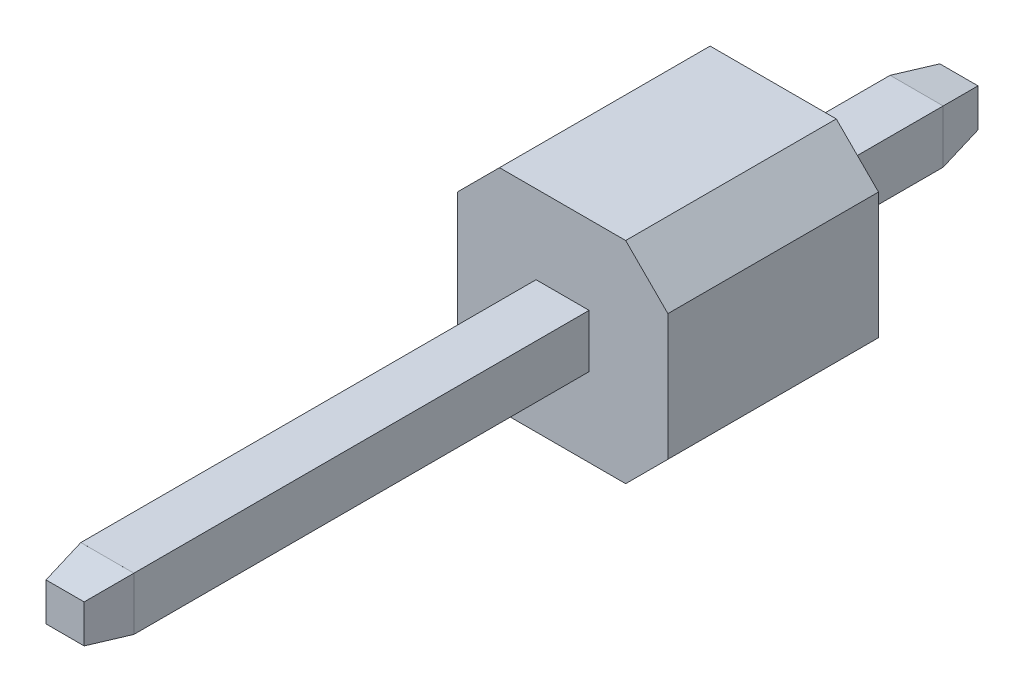
ISO-10303-21;
HEADER;
FILE_DESCRIPTION(('STEP AP214'),'2;1');
FILE_NAME('part.step','',(''),(''),'','','');
FILE_SCHEMA(('AUTOMOTIVE_DESIGN { 1 0 10303 214 1 1 1 1 }'));
ENDSEC;
DATA;
#1=APPLICATION_CONTEXT('core data for automotive mechanical design processes');
#2=APPLICATION_PROTOCOL_DEFINITION('international standard','automotive_design',2000,#1);
#3=PRODUCT_CONTEXT('',#1,'mechanical');
#4=PRODUCT('Part','Part','',(#3));
#5=PRODUCT_RELATED_PRODUCT_CATEGORY('part','',(#4));
#6=PRODUCT_DEFINITION_FORMATION('','',#4);
#7=PRODUCT_DEFINITION_CONTEXT('part definition',#1,'design');
#8=PRODUCT_DEFINITION('design','',#6,#7);
#9=PRODUCT_DEFINITION_SHAPE('','',#8);
#10=(LENGTH_UNIT() NAMED_UNIT(*) SI_UNIT(.MILLI.,.METRE.));
#11=(NAMED_UNIT(*) PLANE_ANGLE_UNIT() SI_UNIT($,.RADIAN.));
#12=(NAMED_UNIT(*) SI_UNIT($,.STERADIAN.) SOLID_ANGLE_UNIT());
#13=UNCERTAINTY_MEASURE_WITH_UNIT(LENGTH_MEASURE(1.E-05),#10,'distance_accuracy_value','');
#14=(GEOMETRIC_REPRESENTATION_CONTEXT(3) GLOBAL_UNCERTAINTY_ASSIGNED_CONTEXT((#13)) GLOBAL_UNIT_ASSIGNED_CONTEXT((#10,
#11,#12)) REPRESENTATION_CONTEXT('',''));
#15=CARTESIAN_POINT('',(0.,0.,0.));
#16=DIRECTION('',(0.,0.,1.));
#17=DIRECTION('',(1.,0.,0.));
#18=AXIS2_PLACEMENT_3D('',#15,#16,#17);
#19=CARTESIAN_POINT('',(0.,0.,-1.73));
#20=DIRECTION('',(0.,0.,1.));
#21=DIRECTION('',(1.,0.,0.));
#22=AXIS2_PLACEMENT_3D('',#19,#20,#21);
#23=PLANE('',#22);
#24=DIRECTION('',(0.,1.,0.));
#25=VECTOR('',#24,1.);
#26=CARTESIAN_POINT('',(0.32,0.32,-1.73));
#27=LINE('',#26,#25);
#28=CARTESIAN_POINT('',(0.32,-0.32,-1.73));
#29=VERTEX_POINT('',#28);
#30=CARTESIAN_POINT('',(0.32,0.32,-1.73));
#31=VERTEX_POINT('',#30);
#32=EDGE_CURVE('E376',#29,#31,#27,.T.);
#33=ORIENTED_EDGE('',*,*,#32,.F.);
#34=DIRECTION('',(1.,0.,0.));
#35=VECTOR('',#34,1.);
#36=CARTESIAN_POINT('',(-0.32,-0.32,-1.73));
#37=LINE('',#36,#35);
#38=CARTESIAN_POINT('',(-0.32,-0.32,-1.73));
#39=VERTEX_POINT('',#38);
#40=EDGE_CURVE('E385',#39,#29,#37,.T.);
#41=ORIENTED_EDGE('',*,*,#40,.F.);
#42=DIRECTION('',(0.,-1.,0.));
#43=VECTOR('',#42,1.);
#44=CARTESIAN_POINT('',(-0.32,0.32,-1.73));
#45=LINE('',#44,#43);
#46=CARTESIAN_POINT('',(-0.32,0.32,-1.73));
#47=VERTEX_POINT('',#46);
#48=EDGE_CURVE('E382',#47,#39,#45,.T.);
#49=ORIENTED_EDGE('',*,*,#48,.F.);
#50=DIRECTION('',(-1.,0.,0.));
#51=VECTOR('',#50,1.);
#52=CARTESIAN_POINT('',(-0.32,0.32,-1.73));
#53=LINE('',#52,#51);
#54=EDGE_CURVE('E379',#31,#47,#53,.T.);
#55=ORIENTED_EDGE('',*,*,#54,.F.);
#56=EDGE_LOOP('',(#33,#41,#49,#55));
#57=FACE_BOUND('',#56,.T.);
#58=DIRECTION('',(0.,-1.,0.));
#59=VECTOR('',#58,1.);
#60=CARTESIAN_POINT('',(-0.319926760161317,0.,-1.73));
#61=LINE('',#60,#59);
#62=CARTESIAN_POINT('',(-0.319926760161317,-0.319926760161317,-1.73));
#63=VERTEX_POINT('',#62);
#64=CARTESIAN_POINT('',(-0.319926760161317,0.319926760161317,-1.73));
#65=VERTEX_POINT('',#64);
#66=EDGE_CURVE('E229',#63,#65,#61,.F.);
#67=ORIENTED_EDGE('',*,*,#66,.F.);
#68=DIRECTION('',(1.,0.,0.));
#69=VECTOR('',#68,1.);
#70=CARTESIAN_POINT('',(0.,-0.319926760161317,-1.73));
#71=LINE('',#70,#69);
#72=CARTESIAN_POINT('',(0.319926760161317,-0.319926760161317,-1.73));
#73=VERTEX_POINT('',#72);
#74=EDGE_CURVE('E260',#73,#63,#71,.F.);
#75=ORIENTED_EDGE('',*,*,#74,.F.);
#76=DIRECTION('',(0.,1.,0.));
#77=VECTOR('',#76,1.);
#78=CARTESIAN_POINT('',(0.319926760161317,0.,-1.73));
#79=LINE('',#78,#77);
#80=CARTESIAN_POINT('',(0.319926760161317,0.319926760161317,-1.73));
#81=VERTEX_POINT('',#80);
#82=EDGE_CURVE('E264',#81,#73,#79,.F.);
#83=ORIENTED_EDGE('',*,*,#82,.F.);
#84=DIRECTION('',(-1.,0.,0.));
#85=VECTOR('',#84,1.);
#86=CARTESIAN_POINT('',(0.,0.319926760161317,-1.73));
#87=LINE('',#86,#85);
#88=EDGE_CURVE('E232',#65,#81,#87,.F.);
#89=ORIENTED_EDGE('',*,*,#88,.F.);
#90=EDGE_LOOP('',(#67,#75,#83,#89));
#91=FACE_BOUND('',#90,.T.);
#92=ADVANCED_FACE('F41',(#57,#91),#23,.F.);
#93=CARTESIAN_POINT('',(1.27,1.27,2.54));
#94=DIRECTION('',(-1.,0.,0.));
#95=DIRECTION('',(0.,-1.,0.));
#96=AXIS2_PLACEMENT_3D('',#93,#94,#95);
#97=PLANE('',#96);
#98=DIRECTION('',(0.,1.,0.));
#99=VECTOR('',#98,1.);
#100=CARTESIAN_POINT('',(1.27,1.27,0.));
#101=LINE('',#100,#99);
#102=CARTESIAN_POINT('',(1.27,-0.760883117545685,0.));
#103=VERTEX_POINT('',#102);
#104=CARTESIAN_POINT('',(1.27,0.760883117545687,0.));
#105=VERTEX_POINT('',#104);
#106=EDGE_CURVE('E305',#103,#105,#101,.T.);
#107=ORIENTED_EDGE('',*,*,#106,.T.);
#108=DIRECTION('',(0.,0.,1.));
#109=VECTOR('',#108,1.);
#110=CARTESIAN_POINT('',(1.27,0.760883117545687,2.54));
#111=LINE('',#110,#109);
#112=CARTESIAN_POINT('',(1.27,0.760883117545687,2.54));
#113=VERTEX_POINT('',#112);
#114=EDGE_CURVE('E11',#105,#113,#111,.T.);
#115=ORIENTED_EDGE('',*,*,#114,.T.);
#116=DIRECTION('',(0.,1.,0.));
#117=VECTOR('',#116,1.);
#118=CARTESIAN_POINT('',(1.27,1.27,2.54));
#119=LINE('',#118,#117);
#120=CARTESIAN_POINT('',(1.27,-0.760883117545685,2.54));
#121=VERTEX_POINT('',#120);
#122=EDGE_CURVE('E307',#121,#113,#119,.T.);
#123=ORIENTED_EDGE('',*,*,#122,.F.);
#124=DIRECTION('',(0.,0.,-1.));
#125=VECTOR('',#124,1.);
#126=CARTESIAN_POINT('',(1.27,-0.760883117545685,2.54));
#127=LINE('',#126,#125);
#128=EDGE_CURVE('E50',#121,#103,#127,.T.);
#129=ORIENTED_EDGE('',*,*,#128,.T.);
#130=EDGE_LOOP('',(#107,#115,#123,#129));
#131=FACE_BOUND('',#130,.T.);
#132=ADVANCED_FACE('F304',(#131),#97,.F.);
#133=CARTESIAN_POINT('',(-1.27,1.27,2.54));
#134=DIRECTION('',(0.,-1.,0.));
#135=DIRECTION('',(0.,0.,-1.));
#136=AXIS2_PLACEMENT_3D('',#133,#134,#135);
#137=PLANE('',#136);
#138=DIRECTION('',(-1.,0.,0.));
#139=VECTOR('',#138,1.);
#140=CARTESIAN_POINT('',(-1.27,1.27,0.));
#141=LINE('',#140,#139);
#142=CARTESIAN_POINT('',(0.760883117545687,1.27,0.));
#143=VERTEX_POINT('',#142);
#144=CARTESIAN_POINT('',(-0.760883117545687,1.27,0.));
#145=VERTEX_POINT('',#144);
#146=EDGE_CURVE('E315',#143,#145,#141,.T.);
#147=ORIENTED_EDGE('',*,*,#146,.T.);
#148=DIRECTION('',(0.,0.,1.));
#149=VECTOR('',#148,1.);
#150=CARTESIAN_POINT('',(-0.760883117545687,1.27,2.54));
#151=LINE('',#150,#149);
#152=CARTESIAN_POINT('',(-0.760883117545687,1.27,2.54));
#153=VERTEX_POINT('',#152);
#154=EDGE_CURVE('E57',#145,#153,#151,.T.);
#155=ORIENTED_EDGE('',*,*,#154,.T.);
#156=DIRECTION('',(-1.,0.,0.));
#157=VECTOR('',#156,1.);
#158=CARTESIAN_POINT('',(-1.27,1.27,2.54));
#159=LINE('',#158,#157);
#160=CARTESIAN_POINT('',(0.760883117545687,1.27,2.54));
#161=VERTEX_POINT('',#160);
#162=EDGE_CURVE('E412',#161,#153,#159,.T.);
#163=ORIENTED_EDGE('',*,*,#162,.F.);
#164=DIRECTION('',(0.,0.,-1.));
#165=VECTOR('',#164,1.);
#166=CARTESIAN_POINT('',(0.760883117545687,1.27,2.54));
#167=LINE('',#166,#165);
#168=EDGE_CURVE('E295',#161,#143,#167,.T.);
#169=ORIENTED_EDGE('',*,*,#168,.T.);
#170=EDGE_LOOP('',(#147,#155,#163,#169));
#171=FACE_BOUND('',#170,.T.);
#172=ADVANCED_FACE('F453',(#171),#137,.F.);
#173=CARTESIAN_POINT('',(-1.27,1.27,2.54));
#174=DIRECTION('',(1.,0.,0.));
#175=DIRECTION('',(0.,1.,0.));
#176=AXIS2_PLACEMENT_3D('',#173,#174,#175);
#177=PLANE('',#176);
#178=DIRECTION('',(0.,-1.,0.));
#179=VECTOR('',#178,1.);
#180=CARTESIAN_POINT('',(-1.27,1.27,0.));
#181=LINE('',#180,#179);
#182=CARTESIAN_POINT('',(-1.27,0.760883117545687,0.));
#183=VERTEX_POINT('',#182);
#184=CARTESIAN_POINT('',(-1.27,-0.760883117545685,0.));
#185=VERTEX_POINT('',#184);
#186=EDGE_CURVE('E318',#183,#185,#181,.T.);
#187=ORIENTED_EDGE('',*,*,#186,.T.);
#188=DIRECTION('',(0.,0.,1.));
#189=VECTOR('',#188,1.);
#190=CARTESIAN_POINT('',(-1.27,-0.760883117545685,2.54));
#191=LINE('',#190,#189);
#192=CARTESIAN_POINT('',(-1.27,-0.760883117545685,2.54));
#193=VERTEX_POINT('',#192);
#194=EDGE_CURVE('E286',#185,#193,#191,.T.);
#195=ORIENTED_EDGE('',*,*,#194,.T.);
#196=DIRECTION('',(0.,-1.,0.));
#197=VECTOR('',#196,1.);
#198=CARTESIAN_POINT('',(-1.27,1.27,2.54));
#199=LINE('',#198,#197);
#200=CARTESIAN_POINT('',(-1.27,0.760883117545687,2.54));
#201=VERTEX_POINT('',#200);
#202=EDGE_CURVE('E413',#201,#193,#199,.T.);
#203=ORIENTED_EDGE('',*,*,#202,.F.);
#204=DIRECTION('',(0.,0.,-1.));
#205=VECTOR('',#204,1.);
#206=CARTESIAN_POINT('',(-1.27,0.760883117545687,2.54));
#207=LINE('',#206,#205);
#208=EDGE_CURVE('E283',#201,#183,#207,.T.);
#209=ORIENTED_EDGE('',*,*,#208,.T.);
#210=EDGE_LOOP('',(#187,#195,#203,#209));
#211=FACE_BOUND('',#210,.T.);
#212=ADVANCED_FACE('F428',(#211),#177,.F.);
#213=CARTESIAN_POINT('',(-1.27,-1.27,2.54));
#214=DIRECTION('',(0.,1.,0.));
#215=DIRECTION('',(0.,0.,1.));
#216=AXIS2_PLACEMENT_3D('',#213,#214,#215);
#217=PLANE('',#216);
#218=DIRECTION('',(1.,0.,0.));
#219=VECTOR('',#218,1.);
#220=CARTESIAN_POINT('',(-1.27,-1.27,2.54));
#221=LINE('',#220,#219);
#222=CARTESIAN_POINT('',(-0.760883117545685,-1.27,2.54));
#223=VERTEX_POINT('',#222);
#224=CARTESIAN_POINT('',(0.760883117545685,-1.27,2.54));
#225=VERTEX_POINT('',#224);
#226=EDGE_CURVE('E324',#223,#225,#221,.T.);
#227=ORIENTED_EDGE('',*,*,#226,.F.);
#228=DIRECTION('',(0.,0.,-1.));
#229=VECTOR('',#228,1.);
#230=CARTESIAN_POINT('',(-0.760883117545685,-1.27,2.54));
#231=LINE('',#230,#229);
#232=CARTESIAN_POINT('',(-0.760883117545685,-1.27,0.));
#233=VERTEX_POINT('',#232);
#234=EDGE_CURVE('E271',#223,#233,#231,.T.);
#235=ORIENTED_EDGE('',*,*,#234,.T.);
#236=DIRECTION('',(1.,0.,0.));
#237=VECTOR('',#236,1.);
#238=CARTESIAN_POINT('',(-1.27,-1.27,0.));
#239=LINE('',#238,#237);
#240=CARTESIAN_POINT('',(0.760883117545685,-1.27,0.));
#241=VERTEX_POINT('',#240);
#242=EDGE_CURVE('E329',#233,#241,#239,.T.);
#243=ORIENTED_EDGE('',*,*,#242,.T.);
#244=DIRECTION('',(0.,0.,1.));
#245=VECTOR('',#244,1.);
#246=CARTESIAN_POINT('',(0.760883117545685,-1.27,2.54));
#247=LINE('',#246,#245);
#248=EDGE_CURVE('E269',#241,#225,#247,.T.);
#249=ORIENTED_EDGE('',*,*,#248,.T.);
#250=EDGE_LOOP('',(#227,#235,#243,#249));
#251=FACE_BOUND('',#250,.T.);
#252=ADVANCED_FACE('F423',(#251),#217,.F.);
#253=CARTESIAN_POINT('',(0.,0.,2.54));
#254=DIRECTION('',(0.,0.,1.));
#255=DIRECTION('',(1.,0.,0.));
#256=AXIS2_PLACEMENT_3D('',#253,#254,#255);
#257=PLANE('',#256);
#258=DIRECTION('',(0.,1.,0.));
#259=VECTOR('',#258,1.);
#260=CARTESIAN_POINT('',(0.32,0.,2.54));
#261=LINE('',#260,#259);
#262=CARTESIAN_POINT('',(0.32,-0.32,2.54));
#263=VERTEX_POINT('',#262);
#264=CARTESIAN_POINT('',(0.32,0.32,2.54));
#265=VERTEX_POINT('',#264);
#266=EDGE_CURVE('E316',#263,#265,#261,.T.);
#267=ORIENTED_EDGE('',*,*,#266,.F.);
#268=DIRECTION('',(1.,0.,0.));
#269=VECTOR('',#268,1.);
#270=CARTESIAN_POINT('',(0.,-0.32,2.54));
#271=LINE('',#270,#269);
#272=CARTESIAN_POINT('',(-0.32,-0.32,2.54));
#273=VERTEX_POINT('',#272);
#274=EDGE_CURVE('E321',#273,#263,#271,.T.);
#275=ORIENTED_EDGE('',*,*,#274,.F.);
#276=DIRECTION('',(0.,-1.,0.));
#277=VECTOR('',#276,1.);
#278=CARTESIAN_POINT('',(-0.32,0.,2.54));
#279=LINE('',#278,#277);
#280=CARTESIAN_POINT('',(-0.32,0.32,2.54));
#281=VERTEX_POINT('',#280);
#282=EDGE_CURVE('E406',#281,#273,#279,.T.);
#283=ORIENTED_EDGE('',*,*,#282,.F.);
#284=DIRECTION('',(-1.,0.,0.));
#285=VECTOR('',#284,1.);
#286=CARTESIAN_POINT('',(0.,0.32,2.54));
#287=LINE('',#286,#285);
#288=EDGE_CURVE('E392',#265,#281,#287,.T.);
#289=ORIENTED_EDGE('',*,*,#288,.F.);
#290=EDGE_LOOP('',(#267,#275,#283,#289));
#291=FACE_BOUND('',#290,.T.);
#292=ORIENTED_EDGE('',*,*,#202,.T.);
#293=DIRECTION('',(-0.707106781186548,0.707106781186548,0.));
#294=VECTOR('',#293,1.);
#295=CARTESIAN_POINT('',(-1.01544155877284,-1.01544155877284,2.54));
#296=LINE('',#295,#294);
#297=EDGE_CURVE('E293',#193,#223,#296,.F.);
#298=ORIENTED_EDGE('',*,*,#297,.T.);
#299=ORIENTED_EDGE('',*,*,#226,.T.);
#300=DIRECTION('',(-0.707106781186548,-0.707106781186547,0.));
#301=VECTOR('',#300,1.);
#302=CARTESIAN_POINT('',(1.01544155877284,-1.01544155877284,2.54));
#303=LINE('',#302,#301);
#304=EDGE_CURVE('E288',#225,#121,#303,.F.);
#305=ORIENTED_EDGE('',*,*,#304,.T.);
#306=ORIENTED_EDGE('',*,*,#122,.T.);
#307=DIRECTION('',(0.707106781186548,-0.707106781186548,0.));
#308=VECTOR('',#307,1.);
#309=CARTESIAN_POINT('',(1.01544155877284,1.01544155877284,2.54));
#310=LINE('',#309,#308);
#311=EDGE_CURVE('E64',#113,#161,#310,.F.);
#312=ORIENTED_EDGE('',*,*,#311,.T.);
#313=ORIENTED_EDGE('',*,*,#162,.T.);
#314=DIRECTION('',(0.707106781186548,0.707106781186548,0.));
#315=VECTOR('',#314,1.);
#316=CARTESIAN_POINT('',(-1.01544155877284,1.01544155877284,2.54));
#317=LINE('',#316,#315);
#318=EDGE_CURVE('E291',#153,#201,#317,.F.);
#319=ORIENTED_EDGE('',*,*,#318,.T.);
#320=EDGE_LOOP('',(#292,#298,#299,#305,#306,#312,#313,#319));
#321=FACE_BOUND('',#320,.T.);
#322=ADVANCED_FACE('F419',(#291,#321),#257,.T.);
#323=CARTESIAN_POINT('',(0.,0.,0.));
#324=DIRECTION('',(0.,0.,1.));
#325=DIRECTION('',(1.,0.,0.));
#326=AXIS2_PLACEMENT_3D('',#323,#324,#325);
#327=PLANE('',#326);
#328=DIRECTION('',(1.,0.,0.));
#329=VECTOR('',#328,1.);
#330=CARTESIAN_POINT('',(0.,-0.32,0.));
#331=LINE('',#330,#329);
#332=CARTESIAN_POINT('',(-0.32,-0.32,0.));
#333=VERTEX_POINT('',#332);
#334=CARTESIAN_POINT('',(0.32,-0.32,0.));
#335=VERTEX_POINT('',#334);
#336=EDGE_CURVE('E337',#333,#335,#331,.T.);
#337=ORIENTED_EDGE('',*,*,#336,.T.);
#338=DIRECTION('',(0.,1.,0.));
#339=VECTOR('',#338,1.);
#340=CARTESIAN_POINT('',(0.32,0.,0.));
#341=LINE('',#340,#339);
#342=CARTESIAN_POINT('',(0.32,0.32,0.));
#343=VERTEX_POINT('',#342);
#344=EDGE_CURVE('E272',#335,#343,#341,.T.);
#345=ORIENTED_EDGE('',*,*,#344,.T.);
#346=DIRECTION('',(-1.,0.,0.));
#347=VECTOR('',#346,1.);
#348=CARTESIAN_POINT('',(0.,0.32,0.));
#349=LINE('',#348,#347);
#350=CARTESIAN_POINT('',(-0.32,0.32,0.));
#351=VERTEX_POINT('',#350);
#352=EDGE_CURVE('E331',#343,#351,#349,.T.);
#353=ORIENTED_EDGE('',*,*,#352,.T.);
#354=DIRECTION('',(0.,-1.,0.));
#355=VECTOR('',#354,1.);
#356=CARTESIAN_POINT('',(-0.32,0.,0.));
#357=LINE('',#356,#355);
#358=EDGE_CURVE('E334',#351,#333,#357,.T.);
#359=ORIENTED_EDGE('',*,*,#358,.T.);
#360=EDGE_LOOP('',(#337,#345,#353,#359));
#361=FACE_BOUND('',#360,.T.);
#362=ORIENTED_EDGE('',*,*,#242,.F.);
#363=DIRECTION('',(0.707106781186548,-0.707106781186548,0.));
#364=VECTOR('',#363,1.);
#365=CARTESIAN_POINT('',(-0.760883117545685,-1.27,0.));
#366=LINE('',#365,#364);
#367=EDGE_CURVE('E281',#233,#185,#366,.F.);
#368=ORIENTED_EDGE('',*,*,#367,.T.);
#369=ORIENTED_EDGE('',*,*,#186,.F.);
#370=DIRECTION('',(-0.707106781186548,-0.707106781186548,0.));
#371=VECTOR('',#370,1.);
#372=CARTESIAN_POINT('',(-1.27,0.760883117545687,0.));
#373=LINE('',#372,#371);
#374=EDGE_CURVE('E279',#183,#145,#373,.F.);
#375=ORIENTED_EDGE('',*,*,#374,.T.);
#376=ORIENTED_EDGE('',*,*,#146,.F.);
#377=DIRECTION('',(-0.707106781186548,0.707106781186548,0.));
#378=VECTOR('',#377,1.);
#379=CARTESIAN_POINT('',(0.760883117545687,1.27,0.));
#380=LINE('',#379,#378);
#381=EDGE_CURVE('E277',#143,#105,#380,.F.);
#382=ORIENTED_EDGE('',*,*,#381,.T.);
#383=ORIENTED_EDGE('',*,*,#106,.F.);
#384=DIRECTION('',(0.707106781186548,0.707106781186547,0.));
#385=VECTOR('',#384,1.);
#386=CARTESIAN_POINT('',(1.27,-0.760883117545685,0.));
#387=LINE('',#386,#385);
#388=EDGE_CURVE('E275',#103,#241,#387,.F.);
#389=ORIENTED_EDGE('',*,*,#388,.T.);
#390=EDGE_LOOP('',(#362,#368,#369,#375,#376,#382,#383,#389));
#391=FACE_BOUND('',#390,.T.);
#392=ADVANCED_FACE('F312',(#361,#391),#327,.F.);
#393=CARTESIAN_POINT('',(-0.32,0.32,-1.73));
#394=DIRECTION('',(0.,1.,0.));
#395=DIRECTION('',(0.,0.,1.));
#396=AXIS2_PLACEMENT_3D('',#393,#394,#395);
#397=PLANE('',#396);
#398=ORIENTED_EDGE('',*,*,#352,.F.);
#399=DIRECTION('',(0.,0.,1.));
#400=VECTOR('',#399,1.);
#401=CARTESIAN_POINT('',(0.32,0.32,-1.73));
#402=LINE('',#401,#400);
#403=EDGE_CURVE('E401',#31,#343,#402,.T.);
#404=ORIENTED_EDGE('',*,*,#403,.F.);
#405=ORIENTED_EDGE('',*,*,#54,.T.);
#406=DIRECTION('',(0.,0.,1.));
#407=VECTOR('',#406,1.);
#408=CARTESIAN_POINT('',(-0.32,0.32,-1.73));
#409=LINE('',#408,#407);
#410=EDGE_CURVE('E398',#47,#351,#409,.T.);
#411=ORIENTED_EDGE('',*,*,#410,.T.);
#412=EDGE_LOOP('',(#398,#404,#405,#411));
#413=FACE_BOUND('',#412,.T.);
#414=ADVANCED_FACE('F473',(#413),#397,.T.);
#415=CARTESIAN_POINT('',(-0.32,0.32,-1.73));
#416=DIRECTION('',(-1.,0.,0.));
#417=DIRECTION('',(0.,-1.,0.));
#418=AXIS2_PLACEMENT_3D('',#415,#416,#417);
#419=PLANE('',#418);
#420=ORIENTED_EDGE('',*,*,#358,.F.);
#421=ORIENTED_EDGE('',*,*,#410,.F.);
#422=ORIENTED_EDGE('',*,*,#48,.T.);
#423=DIRECTION('',(0.,0.,1.));
#424=VECTOR('',#423,1.);
#425=CARTESIAN_POINT('',(-0.32,-0.32,-1.73));
#426=LINE('',#425,#424);
#427=EDGE_CURVE('E394',#39,#333,#426,.T.);
#428=ORIENTED_EDGE('',*,*,#427,.T.);
#429=EDGE_LOOP('',(#420,#421,#422,#428));
#430=FACE_BOUND('',#429,.T.);
#431=ADVANCED_FACE('F469',(#430),#419,.T.);
#432=CARTESIAN_POINT('',(-0.32,-0.32,-1.73));
#433=DIRECTION('',(0.,-1.,0.));
#434=DIRECTION('',(0.,0.,-1.));
#435=AXIS2_PLACEMENT_3D('',#432,#433,#434);
#436=PLANE('',#435);
#437=ORIENTED_EDGE('',*,*,#336,.F.);
#438=ORIENTED_EDGE('',*,*,#427,.F.);
#439=ORIENTED_EDGE('',*,*,#40,.T.);
#440=DIRECTION('',(0.,0.,1.));
#441=VECTOR('',#440,1.);
#442=CARTESIAN_POINT('',(0.32,-0.32,-1.73));
#443=LINE('',#442,#441);
#444=EDGE_CURVE('E389',#29,#335,#443,.T.);
#445=ORIENTED_EDGE('',*,*,#444,.T.);
#446=EDGE_LOOP('',(#437,#438,#439,#445));
#447=FACE_BOUND('',#446,.T.);
#448=ADVANCED_FACE('F465',(#447),#436,.T.);
#449=CARTESIAN_POINT('',(0.32,0.32,-1.73));
#450=DIRECTION('',(1.,0.,0.));
#451=DIRECTION('',(0.,0.,-1.));
#452=AXIS2_PLACEMENT_3D('',#449,#450,#451);
#453=PLANE('',#452);
#454=ORIENTED_EDGE('',*,*,#344,.F.);
#455=ORIENTED_EDGE('',*,*,#444,.F.);
#456=ORIENTED_EDGE('',*,*,#32,.T.);
#457=ORIENTED_EDGE('',*,*,#403,.T.);
#458=EDGE_LOOP('',(#454,#455,#456,#457));
#459=FACE_BOUND('',#458,.T.);
#460=ADVANCED_FACE('F476',(#459),#453,.T.);
#461=CARTESIAN_POINT('',(0.32,-0.32,8.03));
#462=VERTEX_POINT('',#461);
#463=EDGE_CURVE('E393',#263,#462,#443,.T.);
#464=ORIENTED_EDGE('',*,*,#463,.F.);
#465=ORIENTED_EDGE('',*,*,#266,.T.);
#466=CARTESIAN_POINT('',(0.32,0.32,8.03));
#467=VERTEX_POINT('',#466);
#468=EDGE_CURVE('E388',#265,#467,#402,.T.);
#469=ORIENTED_EDGE('',*,*,#468,.T.);
#470=DIRECTION('',(0.,1.,0.));
#471=VECTOR('',#470,1.);
#472=CARTESIAN_POINT('',(0.32,0.32,8.03));
#473=LINE('',#472,#471);
#474=EDGE_CURVE('E249',#462,#467,#473,.T.);
#475=ORIENTED_EDGE('',*,*,#474,.F.);
#476=EDGE_LOOP('',(#464,#465,#469,#475));
#477=FACE_BOUND('',#476,.T.);
#478=ADVANCED_FACE('F463',(#477),#453,.T.);
#479=CARTESIAN_POINT('',(-0.32,-0.32,8.03));
#480=VERTEX_POINT('',#479);
#481=EDGE_CURVE('E397',#273,#480,#426,.T.);
#482=ORIENTED_EDGE('',*,*,#481,.F.);
#483=ORIENTED_EDGE('',*,*,#274,.T.);
#484=ORIENTED_EDGE('',*,*,#463,.T.);
#485=DIRECTION('',(1.,0.,0.));
#486=VECTOR('',#485,1.);
#487=CARTESIAN_POINT('',(-0.32,-0.32,8.03));
#488=LINE('',#487,#486);
#489=EDGE_CURVE('E365',#480,#462,#488,.T.);
#490=ORIENTED_EDGE('',*,*,#489,.F.);
#491=EDGE_LOOP('',(#482,#483,#484,#490));
#492=FACE_BOUND('',#491,.T.);
#493=ADVANCED_FACE('F459',(#492),#436,.T.);
#494=CARTESIAN_POINT('',(-0.32,0.32,8.03));
#495=VERTEX_POINT('',#494);
#496=EDGE_CURVE('E400',#281,#495,#409,.T.);
#497=ORIENTED_EDGE('',*,*,#496,.F.);
#498=ORIENTED_EDGE('',*,*,#282,.T.);
#499=ORIENTED_EDGE('',*,*,#481,.T.);
#500=DIRECTION('',(0.,-1.,0.));
#501=VECTOR('',#500,1.);
#502=CARTESIAN_POINT('',(-0.32,0.32,8.03));
#503=LINE('',#502,#501);
#504=EDGE_CURVE('E369',#495,#480,#503,.T.);
#505=ORIENTED_EDGE('',*,*,#504,.F.);
#506=EDGE_LOOP('',(#497,#498,#499,#505));
#507=FACE_BOUND('',#506,.T.);
#508=ADVANCED_FACE('F462',(#507),#419,.T.);
#509=ORIENTED_EDGE('',*,*,#468,.F.);
#510=ORIENTED_EDGE('',*,*,#288,.T.);
#511=ORIENTED_EDGE('',*,*,#496,.T.);
#512=DIRECTION('',(-1.,0.,0.));
#513=VECTOR('',#512,1.);
#514=CARTESIAN_POINT('',(-0.32,0.32,8.03));
#515=LINE('',#514,#513);
#516=EDGE_CURVE('E362',#467,#495,#515,.T.);
#517=ORIENTED_EDGE('',*,*,#516,.F.);
#518=EDGE_LOOP('',(#509,#510,#511,#517));
#519=FACE_BOUND('',#518,.T.);
#520=ADVANCED_FACE('F354',(#519),#397,.T.);
#521=CARTESIAN_POINT('',(0.,0.,8.03));
#522=DIRECTION('',(0.,0.,1.));
#523=DIRECTION('',(1.,0.,0.));
#524=AXIS2_PLACEMENT_3D('',#521,#522,#523);
#525=PLANE('',#524);
#526=DIRECTION('',(0.,-1.,0.));
#527=VECTOR('',#526,1.);
#528=CARTESIAN_POINT('',(0.319926760161317,0.23,8.03));
#529=LINE('',#528,#527);
#530=CARTESIAN_POINT('',(0.319926760161317,-0.319926760161317,8.03));
#531=VERTEX_POINT('',#530);
#532=CARTESIAN_POINT('',(0.319926760161317,0.319926760161317,8.03));
#533=VERTEX_POINT('',#532);
#534=EDGE_CURVE('E228',#531,#533,#529,.F.);
#535=ORIENTED_EDGE('',*,*,#534,.F.);
#536=DIRECTION('',(-1.,0.,0.));
#537=VECTOR('',#536,1.);
#538=CARTESIAN_POINT('',(0.23,-0.319926760161317,8.03));
#539=LINE('',#538,#537);
#540=CARTESIAN_POINT('',(-0.319926760161317,-0.319926760161317,8.03));
#541=VERTEX_POINT('',#540);
#542=EDGE_CURVE('E225',#541,#531,#539,.F.);
#543=ORIENTED_EDGE('',*,*,#542,.F.);
#544=DIRECTION('',(0.,1.,0.));
#545=VECTOR('',#544,1.);
#546=CARTESIAN_POINT('',(-0.319926760161317,0.23,8.03));
#547=LINE('',#546,#545);
#548=CARTESIAN_POINT('',(-0.319926760161317,0.319926760161317,8.03));
#549=VERTEX_POINT('',#548);
#550=EDGE_CURVE('E240',#549,#541,#547,.F.);
#551=ORIENTED_EDGE('',*,*,#550,.F.);
#552=DIRECTION('',(1.,0.,0.));
#553=VECTOR('',#552,1.);
#554=CARTESIAN_POINT('',(0.23,0.319926760161317,8.03));
#555=LINE('',#554,#553);
#556=EDGE_CURVE('E243',#533,#549,#555,.F.);
#557=ORIENTED_EDGE('',*,*,#556,.F.);
#558=EDGE_LOOP('',(#535,#543,#551,#557));
#559=FACE_BOUND('',#558,.T.);
#560=ORIENTED_EDGE('',*,*,#474,.T.);
#561=ORIENTED_EDGE('',*,*,#516,.T.);
#562=ORIENTED_EDGE('',*,*,#504,.T.);
#563=ORIENTED_EDGE('',*,*,#489,.T.);
#564=EDGE_LOOP('',(#560,#561,#562,#563));
#565=FACE_BOUND('',#564,.T.);
#566=ADVANCED_FACE('F350',(#559,#565),#525,.T.);
#567=CARTESIAN_POINT('',(-0.23,0.23,-2.24));
#568=DIRECTION('',(-0.984807753012208,0.,-0.173648177666931));
#569=DIRECTION('',(-0.173648177666931,0.,0.984807753012208));
#570=AXIS2_PLACEMENT_3D('',#567,#568,#569);
#571=PLANE('',#570);
#572=ORIENTED_EDGE('',*,*,#66,.T.);
#573=DIRECTION('',(-0.171087869746036,0.171087869746036,0.970287525247814));
#574=VECTOR('',#573,1.);
#575=CARTESIAN_POINT('',(-0.23,0.23,-2.24));
#576=LINE('',#575,#574);
#577=CARTESIAN_POINT('',(-0.23,0.23,-2.24));
#578=VERTEX_POINT('',#577);
#579=EDGE_CURVE('E246',#578,#65,#576,.T.);
#580=ORIENTED_EDGE('',*,*,#579,.F.);
#581=DIRECTION('',(0.,1.,0.));
#582=VECTOR('',#581,1.);
#583=CARTESIAN_POINT('',(-0.23,0.23,-2.24));
#584=LINE('',#583,#582);
#585=CARTESIAN_POINT('',(-0.23,-0.23,-2.24));
#586=VERTEX_POINT('',#585);
#587=EDGE_CURVE('E263',#586,#578,#584,.T.);
#588=ORIENTED_EDGE('',*,*,#587,.F.);
#589=DIRECTION('',(-0.171087869746036,-0.171087869746036,0.970287525247814));
#590=VECTOR('',#589,1.);
#591=CARTESIAN_POINT('',(-0.216535312779851,-0.216535312779851,-2.31636203583847));
#592=LINE('',#591,#590);
#593=EDGE_CURVE('E251',#586,#63,#592,.T.);
#594=ORIENTED_EDGE('',*,*,#593,.T.);
#595=EDGE_LOOP('',(#572,#580,#588,#594));
#596=FACE_BOUND('',#595,.T.);
#597=ADVANCED_FACE('F353',(#596),#571,.T.);
#598=CARTESIAN_POINT('',(-0.23,0.23,-2.24));
#599=DIRECTION('',(0.,0.984807753012208,-0.173648177666931));
#600=DIRECTION('',(0.,0.173648177666931,0.984807753012208));
#601=AXIS2_PLACEMENT_3D('',#598,#599,#600);
#602=PLANE('',#601);
#603=ORIENTED_EDGE('',*,*,#88,.T.);
#604=DIRECTION('',(0.171087869746036,0.171087869746036,0.970287525247814));
#605=VECTOR('',#604,1.);
#606=CARTESIAN_POINT('',(0.23,0.23,-2.24));
#607=LINE('',#606,#605);
#608=CARTESIAN_POINT('',(0.23,0.23,-2.24));
#609=VERTEX_POINT('',#608);
#610=EDGE_CURVE('E250',#609,#81,#607,.T.);
#611=ORIENTED_EDGE('',*,*,#610,.F.);
#612=DIRECTION('',(1.,0.,0.));
#613=VECTOR('',#612,1.);
#614=CARTESIAN_POINT('',(-0.23,0.23,-2.24));
#615=LINE('',#614,#613);
#616=EDGE_CURVE('E517',#578,#609,#615,.T.);
#617=ORIENTED_EDGE('',*,*,#616,.F.);
#618=ORIENTED_EDGE('',*,*,#579,.T.);
#619=EDGE_LOOP('',(#603,#611,#617,#618));
#620=FACE_BOUND('',#619,.T.);
#621=ADVANCED_FACE('F497',(#620),#602,.T.);
#622=CARTESIAN_POINT('',(0.23,0.23,-2.24));
#623=DIRECTION('',(0.984807753012208,0.,-0.173648177666931));
#624=DIRECTION('',(-0.173648177666931,0.,-0.984807753012208));
#625=AXIS2_PLACEMENT_3D('',#622,#623,#624);
#626=PLANE('',#625);
#627=ORIENTED_EDGE('',*,*,#82,.T.);
#628=DIRECTION('',(0.171087869746036,-0.171087869746036,0.970287525247814));
#629=VECTOR('',#628,1.);
#630=CARTESIAN_POINT('',(0.216535312779851,-0.216535312779851,-2.31636203583847));
#631=LINE('',#630,#629);
#632=CARTESIAN_POINT('',(0.23,-0.23,-2.24));
#633=VERTEX_POINT('',#632);
#634=EDGE_CURVE('E254',#633,#73,#631,.T.);
#635=ORIENTED_EDGE('',*,*,#634,.F.);
#636=DIRECTION('',(0.,-1.,0.));
#637=VECTOR('',#636,1.);
#638=CARTESIAN_POINT('',(0.23,0.23,-2.24));
#639=LINE('',#638,#637);
#640=EDGE_CURVE('E514',#609,#633,#639,.T.);
#641=ORIENTED_EDGE('',*,*,#640,.F.);
#642=ORIENTED_EDGE('',*,*,#610,.T.);
#643=EDGE_LOOP('',(#627,#635,#641,#642));
#644=FACE_BOUND('',#643,.T.);
#645=ADVANCED_FACE('F502',(#644),#626,.T.);
#646=CARTESIAN_POINT('',(-0.23,-0.23,-2.24));
#647=DIRECTION('',(0.,-0.984807753012208,-0.173648177666931));
#648=DIRECTION('',(0.,0.173648177666931,-0.984807753012208));
#649=AXIS2_PLACEMENT_3D('',#646,#647,#648);
#650=PLANE('',#649);
#651=ORIENTED_EDGE('',*,*,#74,.T.);
#652=ORIENTED_EDGE('',*,*,#593,.F.);
#653=DIRECTION('',(-1.,0.,0.));
#654=VECTOR('',#653,1.);
#655=CARTESIAN_POINT('',(-0.23,-0.23,-2.24));
#656=LINE('',#655,#654);
#657=EDGE_CURVE('E255',#633,#586,#656,.T.);
#658=ORIENTED_EDGE('',*,*,#657,.F.);
#659=ORIENTED_EDGE('',*,*,#634,.T.);
#660=EDGE_LOOP('',(#651,#652,#658,#659));
#661=FACE_BOUND('',#660,.T.);
#662=ADVANCED_FACE('F499',(#661),#650,.T.);
#663=CARTESIAN_POINT('',(0.,0.,-2.24));
#664=DIRECTION('',(0.,0.,1.));
#665=DIRECTION('',(1.,0.,0.));
#666=AXIS2_PLACEMENT_3D('',#663,#664,#665);
#667=PLANE('',#666);
#668=ORIENTED_EDGE('',*,*,#587,.T.);
#669=ORIENTED_EDGE('',*,*,#616,.T.);
#670=ORIENTED_EDGE('',*,*,#640,.T.);
#671=ORIENTED_EDGE('',*,*,#657,.T.);
#672=EDGE_LOOP('',(#668,#669,#670,#671));
#673=FACE_BOUND('',#672,.T.);
#674=ADVANCED_FACE('F495',(#673),#667,.F.);
#675=CARTESIAN_POINT('',(0.23,0.23,8.54));
#676=DIRECTION('',(0.984807753012208,0.,0.173648177666931));
#677=DIRECTION('',(0.173648177666931,0.,-0.984807753012208));
#678=AXIS2_PLACEMENT_3D('',#675,#676,#677);
#679=PLANE('',#678);
#680=ORIENTED_EDGE('',*,*,#534,.T.);
#681=DIRECTION('',(0.171087869746036,0.171087869746036,-0.970287525247814));
#682=VECTOR('',#681,1.);
#683=CARTESIAN_POINT('',(0.23,0.23,8.54));
#684=LINE('',#683,#682);
#685=CARTESIAN_POINT('',(0.23,0.23,8.54));
#686=VERTEX_POINT('',#685);
#687=EDGE_CURVE('E209',#686,#533,#684,.T.);
#688=ORIENTED_EDGE('',*,*,#687,.F.);
#689=DIRECTION('',(0.,1.,0.));
#690=VECTOR('',#689,1.);
#691=CARTESIAN_POINT('',(0.23,0.23,8.54));
#692=LINE('',#691,#690);
#693=CARTESIAN_POINT('',(0.23,-0.23,8.54));
#694=VERTEX_POINT('',#693);
#695=EDGE_CURVE('E216',#694,#686,#692,.T.);
#696=ORIENTED_EDGE('',*,*,#695,.F.);
#697=DIRECTION('',(0.171087869746036,-0.171087869746036,-0.970287525247814));
#698=VECTOR('',#697,1.);
#699=CARTESIAN_POINT('',(0.216535312779851,-0.216535312779851,8.61636203583847));
#700=LINE('',#699,#698);
#701=EDGE_CURVE('E342',#694,#531,#700,.T.);
#702=ORIENTED_EDGE('',*,*,#701,.T.);
#703=EDGE_LOOP('',(#680,#688,#696,#702));
#704=FACE_BOUND('',#703,.T.);
#705=ADVANCED_FACE('F227',(#704),#679,.T.);
#706=CARTESIAN_POINT('',(0.23,0.23,8.54));
#707=DIRECTION('',(0.,0.984807753012208,0.173648177666931));
#708=DIRECTION('',(0.,-0.173648177666931,0.984807753012208));
#709=AXIS2_PLACEMENT_3D('',#706,#707,#708);
#710=PLANE('',#709);
#711=ORIENTED_EDGE('',*,*,#556,.T.);
#712=DIRECTION('',(-0.171087869746036,0.171087869746036,-0.970287525247814));
#713=VECTOR('',#712,1.);
#714=CARTESIAN_POINT('',(-0.23,0.23,8.54));
#715=LINE('',#714,#713);
#716=CARTESIAN_POINT('',(-0.23,0.23,8.54));
#717=VERTEX_POINT('',#716);
#718=EDGE_CURVE('E212',#717,#549,#715,.T.);
#719=ORIENTED_EDGE('',*,*,#718,.F.);
#720=DIRECTION('',(-1.,0.,0.));
#721=VECTOR('',#720,1.);
#722=CARTESIAN_POINT('',(0.23,0.23,8.54));
#723=LINE('',#722,#721);
#724=EDGE_CURVE('E204',#686,#717,#723,.T.);
#725=ORIENTED_EDGE('',*,*,#724,.F.);
#726=ORIENTED_EDGE('',*,*,#687,.T.);
#727=EDGE_LOOP('',(#711,#719,#725,#726));
#728=FACE_BOUND('',#727,.T.);
#729=ADVANCED_FACE('F207',(#728),#710,.T.);
#730=CARTESIAN_POINT('',(-0.23,0.23,8.54));
#731=DIRECTION('',(-0.984807753012208,0.,0.173648177666931));
#732=DIRECTION('',(0.173648177666931,0.,0.984807753012208));
#733=AXIS2_PLACEMENT_3D('',#730,#731,#732);
#734=PLANE('',#733);
#735=ORIENTED_EDGE('',*,*,#550,.T.);
#736=DIRECTION('',(-0.171087869746036,-0.171087869746036,-0.970287525247814));
#737=VECTOR('',#736,1.);
#738=CARTESIAN_POINT('',(-0.216535312779851,-0.216535312779851,8.61636203583847));
#739=LINE('',#738,#737);
#740=CARTESIAN_POINT('',(-0.23,-0.23,8.54));
#741=VERTEX_POINT('',#740);
#742=EDGE_CURVE('E234',#741,#541,#739,.T.);
#743=ORIENTED_EDGE('',*,*,#742,.F.);
#744=DIRECTION('',(0.,-1.,0.));
#745=VECTOR('',#744,1.);
#746=CARTESIAN_POINT('',(-0.23,0.23,8.54));
#747=LINE('',#746,#745);
#748=EDGE_CURVE('E215',#717,#741,#747,.T.);
#749=ORIENTED_EDGE('',*,*,#748,.F.);
#750=ORIENTED_EDGE('',*,*,#718,.T.);
#751=EDGE_LOOP('',(#735,#743,#749,#750));
#752=FACE_BOUND('',#751,.T.);
#753=ADVANCED_FACE('F348',(#752),#734,.T.);
#754=CARTESIAN_POINT('',(0.23,-0.23,8.54));
#755=DIRECTION('',(0.,-0.984807753012208,0.173648177666931));
#756=DIRECTION('',(0.,-0.173648177666931,-0.984807753012208));
#757=AXIS2_PLACEMENT_3D('',#754,#755,#756);
#758=PLANE('',#757);
#759=ORIENTED_EDGE('',*,*,#542,.T.);
#760=ORIENTED_EDGE('',*,*,#701,.F.);
#761=DIRECTION('',(1.,0.,0.));
#762=VECTOR('',#761,1.);
#763=CARTESIAN_POINT('',(0.23,-0.23,8.54));
#764=LINE('',#763,#762);
#765=EDGE_CURVE('E221',#741,#694,#764,.T.);
#766=ORIENTED_EDGE('',*,*,#765,.F.);
#767=ORIENTED_EDGE('',*,*,#742,.T.);
#768=EDGE_LOOP('',(#759,#760,#766,#767));
#769=FACE_BOUND('',#768,.T.);
#770=ADVANCED_FACE('F346',(#769),#758,.T.);
#771=CARTESIAN_POINT('',(0.,0.,8.54));
#772=DIRECTION('',(0.,0.,-1.));
#773=DIRECTION('',(-1.,0.,0.));
#774=AXIS2_PLACEMENT_3D('',#771,#772,#773);
#775=PLANE('',#774);
#776=ORIENTED_EDGE('',*,*,#695,.T.);
#777=ORIENTED_EDGE('',*,*,#724,.T.);
#778=ORIENTED_EDGE('',*,*,#748,.T.);
#779=ORIENTED_EDGE('',*,*,#765,.T.);
#780=EDGE_LOOP('',(#776,#777,#778,#779));
#781=FACE_BOUND('',#780,.T.);
#782=ADVANCED_FACE('F219',(#781),#775,.F.);
#783=CARTESIAN_POINT('',(-0.760883117545685,-1.27,2.54));
#784=DIRECTION('',(0.707106781186547,0.707106781186547,0.));
#785=DIRECTION('',(0.,0.,-1.));
#786=AXIS2_PLACEMENT_3D('',#783,#784,#785);
#787=PLANE('',#786);
#788=ORIENTED_EDGE('',*,*,#297,.F.);
#789=ORIENTED_EDGE('',*,*,#194,.F.);
#790=ORIENTED_EDGE('',*,*,#367,.F.);
#791=ORIENTED_EDGE('',*,*,#234,.F.);
#792=EDGE_LOOP('',(#788,#789,#790,#791));
#793=FACE_BOUND('',#792,.T.);
#794=ADVANCED_FACE('F430',(#793),#787,.F.);
#795=CARTESIAN_POINT('',(-1.27,0.760883117545687,2.54));
#796=DIRECTION('',(0.707106781186547,-0.707106781186547,0.));
#797=DIRECTION('',(0.,0.,-1.));
#798=AXIS2_PLACEMENT_3D('',#795,#796,#797);
#799=PLANE('',#798);
#800=ORIENTED_EDGE('',*,*,#318,.F.);
#801=ORIENTED_EDGE('',*,*,#154,.F.);
#802=ORIENTED_EDGE('',*,*,#374,.F.);
#803=ORIENTED_EDGE('',*,*,#208,.F.);
#804=EDGE_LOOP('',(#800,#801,#802,#803));
#805=FACE_BOUND('',#804,.T.);
#806=ADVANCED_FACE('F432',(#805),#799,.F.);
#807=CARTESIAN_POINT('',(0.760883117545687,1.27,2.54));
#808=DIRECTION('',(-0.707106781186547,-0.707106781186547,0.));
#809=DIRECTION('',(0.,0.,-1.));
#810=AXIS2_PLACEMENT_3D('',#807,#808,#809);
#811=PLANE('',#810);
#812=ORIENTED_EDGE('',*,*,#311,.F.);
#813=ORIENTED_EDGE('',*,*,#114,.F.);
#814=ORIENTED_EDGE('',*,*,#381,.F.);
#815=ORIENTED_EDGE('',*,*,#168,.F.);
#816=EDGE_LOOP('',(#812,#813,#814,#815));
#817=FACE_BOUND('',#816,.T.);
#818=ADVANCED_FACE('F438',(#817),#811,.F.);
#819=CARTESIAN_POINT('',(1.27,-0.760883117545685,2.54));
#820=DIRECTION('',(-0.707106781186547,0.707106781186548,0.));
#821=DIRECTION('',(0.,0.,-1.));
#822=AXIS2_PLACEMENT_3D('',#819,#820,#821);
#823=PLANE('',#822);
#824=ORIENTED_EDGE('',*,*,#304,.F.);
#825=ORIENTED_EDGE('',*,*,#248,.F.);
#826=ORIENTED_EDGE('',*,*,#388,.F.);
#827=ORIENTED_EDGE('',*,*,#128,.F.);
#828=EDGE_LOOP('',(#824,#825,#826,#827));
#829=FACE_BOUND('',#828,.T.);
#830=ADVANCED_FACE('F44',(#829),#823,.F.);
#831=CLOSED_SHELL('',(#92,#132,#172,#212,#252,#322,#392,#414,#431,#448,#460,#478,#493,#508,#520,
#566,#597,#621,#645,#662,#674,#705,#729,#753,#770,#782,#794,#806,#818,#830));
#832=MANIFOLD_SOLID_BREP('B2',#831);
#833=ADVANCED_BREP_SHAPE_REPRESENTATION('',(#18,#832),#14);
#834=SHAPE_DEFINITION_REPRESENTATION(#9,#833);
ENDSEC;
END-ISO-10303-21;
